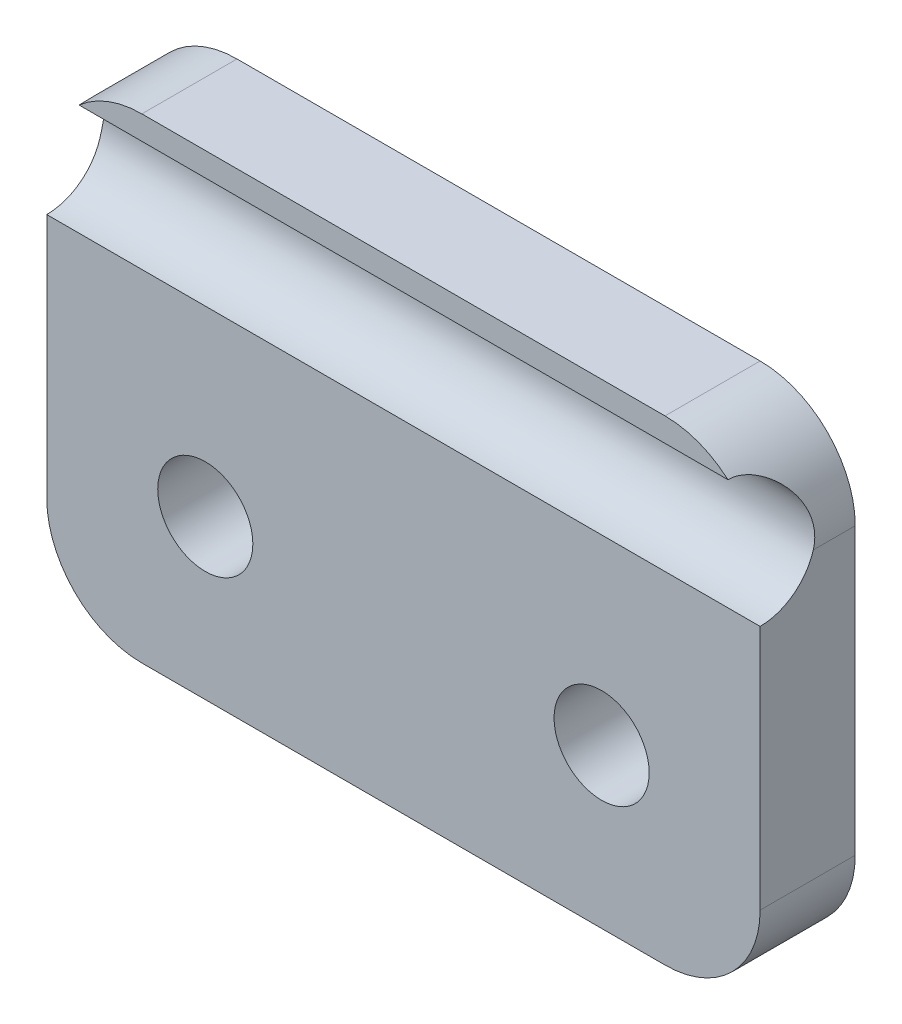
ISO-10303-21;
HEADER;
FILE_DESCRIPTION(('STEP AP214'),'2;1');
FILE_NAME('part.step','',(''),(''),'','','');
FILE_SCHEMA(('AUTOMOTIVE_DESIGN { 1 0 10303 214 1 1 1 1 }'));
ENDSEC;
DATA;
#1=APPLICATION_CONTEXT('core data for automotive mechanical design processes');
#2=APPLICATION_PROTOCOL_DEFINITION('international standard','automotive_design',2000,#1);
#3=PRODUCT_CONTEXT('',#1,'mechanical');
#4=PRODUCT('Part','Part','',(#3));
#5=PRODUCT_RELATED_PRODUCT_CATEGORY('part','',(#4));
#6=PRODUCT_DEFINITION_FORMATION('','',#4);
#7=PRODUCT_DEFINITION_CONTEXT('part definition',#1,'design');
#8=PRODUCT_DEFINITION('design','',#6,#7);
#9=PRODUCT_DEFINITION_SHAPE('','',#8);
#10=(LENGTH_UNIT() NAMED_UNIT(*) SI_UNIT(.MILLI.,.METRE.));
#11=(NAMED_UNIT(*) PLANE_ANGLE_UNIT() SI_UNIT($,.RADIAN.));
#12=(NAMED_UNIT(*) SI_UNIT($,.STERADIAN.) SOLID_ANGLE_UNIT());
#13=UNCERTAINTY_MEASURE_WITH_UNIT(LENGTH_MEASURE(1.E-05),#10,'distance_accuracy_value','');
#14=(GEOMETRIC_REPRESENTATION_CONTEXT(3) GLOBAL_UNCERTAINTY_ASSIGNED_CONTEXT((#13)) GLOBAL_UNIT_ASSIGNED_CONTEXT((#10,
#11,#12)) REPRESENTATION_CONTEXT('',''));
#15=CARTESIAN_POINT('',(0.,0.,0.));
#16=DIRECTION('',(0.,0.,1.));
#17=DIRECTION('',(1.,0.,0.));
#18=AXIS2_PLACEMENT_3D('',#15,#16,#17);
#19=CARTESIAN_POINT('',(16.5,9.,6.));
#20=DIRECTION('',(0.,0.,1.));
#21=DIRECTION('',(1.,0.,0.));
#22=AXIS2_PLACEMENT_3D('',#19,#20,#21);
#23=PLANE('',#22);
#24=CARTESIAN_POINT('',(-12.5,-5.,6.));
#25=DIRECTION('',(0.,0.,1.));
#26=DIRECTION('',(1.,0.,0.));
#27=AXIS2_PLACEMENT_3D('',#24,#25,#26);
#28=CIRCLE('',#27,3.);
#29=CARTESIAN_POINT('',(-9.5,-5.,6.));
#30=VERTEX_POINT('',#29);
#31=EDGE_CURVE('E245',#30,#30,#28,.T.);
#32=ORIENTED_EDGE('',*,*,#31,.F.);
#33=EDGE_LOOP('',(#32));
#34=FACE_BOUND('',#33,.T.);
#35=CARTESIAN_POINT('',(12.5,-5.,6.));
#36=DIRECTION('',(0.,0.,1.));
#37=DIRECTION('',(1.,0.,0.));
#38=AXIS2_PLACEMENT_3D('',#35,#36,#37);
#39=CIRCLE('',#38,3.);
#40=CARTESIAN_POINT('',(15.5,-5.,6.));
#41=VERTEX_POINT('',#40);
#42=EDGE_CURVE('E248',#41,#41,#39,.T.);
#43=ORIENTED_EDGE('',*,*,#42,.F.);
#44=EDGE_LOOP('',(#43));
#45=FACE_BOUND('',#44,.T.);
#46=DIRECTION('',(1.,0.,0.));
#47=VECTOR('',#46,1.);
#48=CARTESIAN_POINT('',(-22.5,6.5,6.));
#49=LINE('',#48,#47);
#50=CARTESIAN_POINT('',(-22.5,6.5,6.));
#51=VERTEX_POINT('',#50);
#52=CARTESIAN_POINT('',(22.5,6.5,6.));
#53=VERTEX_POINT('',#52);
#54=EDGE_CURVE('E11',#51,#53,#49,.T.);
#55=ORIENTED_EDGE('',*,*,#54,.F.);
#56=DIRECTION('',(0.,-1.,0.));
#57=VECTOR('',#56,1.);
#58=CARTESIAN_POINT('',(-22.5,-8.99999999999996,6.));
#59=LINE('',#58,#57);
#60=CARTESIAN_POINT('',(-22.5,-8.99999999999996,6.));
#61=VERTEX_POINT('',#60);
#62=EDGE_CURVE('E117',#51,#61,#59,.T.);
#63=ORIENTED_EDGE('',*,*,#62,.T.);
#64=CARTESIAN_POINT('',(-16.5,-9.,6.));
#65=DIRECTION('',(0.,0.,1.));
#66=DIRECTION('',(1.,0.,0.));
#67=AXIS2_PLACEMENT_3D('',#64,#65,#66);
#68=CIRCLE('',#67,6.);
#69=CARTESIAN_POINT('',(-16.5,-15.,6.));
#70=VERTEX_POINT('',#69);
#71=EDGE_CURVE('E110',#61,#70,#68,.T.);
#72=ORIENTED_EDGE('',*,*,#71,.T.);
#73=DIRECTION('',(1.,0.,0.));
#74=VECTOR('',#73,1.);
#75=CARTESIAN_POINT('',(-16.5,-15.,6.));
#76=LINE('',#75,#74);
#77=CARTESIAN_POINT('',(16.5,-15.,6.));
#78=VERTEX_POINT('',#77);
#79=EDGE_CURVE('E114',#70,#78,#76,.T.);
#80=ORIENTED_EDGE('',*,*,#79,.T.);
#81=CARTESIAN_POINT('',(16.5,-9.,6.));
#82=DIRECTION('',(0.,0.,1.));
#83=DIRECTION('',(1.,0.,0.));
#84=AXIS2_PLACEMENT_3D('',#81,#82,#83);
#85=CIRCLE('',#84,6.);
#86=CARTESIAN_POINT('',(22.5,-8.99999999999996,6.));
#87=VERTEX_POINT('',#86);
#88=EDGE_CURVE('E59',#78,#87,#85,.T.);
#89=ORIENTED_EDGE('',*,*,#88,.T.);
#90=DIRECTION('',(0.,1.,0.));
#91=VECTOR('',#90,1.);
#92=CARTESIAN_POINT('',(22.5,-8.99999999999996,6.));
#93=LINE('',#92,#91);
#94=EDGE_CURVE('E135',#87,#53,#93,.T.);
#95=ORIENTED_EDGE('',*,*,#94,.T.);
#96=EDGE_LOOP('',(#55,#63,#72,#80,#89,#95));
#97=FACE_BOUND('',#96,.T.);
#98=ADVANCED_FACE('F34',(#34,#45,#97),#23,.T.);
#99=CARTESIAN_POINT('',(16.5,9.,6.));
#100=DIRECTION('',(0.,0.,-1.));
#101=DIRECTION('',(-1.,0.,0.));
#102=AXIS2_PLACEMENT_3D('',#99,#100,#101);
#103=CYLINDRICAL_SURFACE('',#102,6.);
#104=CARTESIAN_POINT('',(16.5,9.,6.));
#105=DIRECTION('',(0.,0.,1.));
#106=DIRECTION('',(1.,0.,0.));
#107=AXIS2_PLACEMENT_3D('',#104,#105,#106);
#108=CIRCLE('',#107,6.);
#109=CARTESIAN_POINT('',(20.4686269665969,13.5,6.));
#110=VERTEX_POINT('',#109);
#111=CARTESIAN_POINT('',(16.5,15.,6.));
#112=VERTEX_POINT('',#111);
#113=EDGE_CURVE('E100',#110,#112,#108,.T.);
#114=ORIENTED_EDGE('',*,*,#113,.F.);
#115=CARTESIAN_POINT('',(20.4686269665969,13.5,6.));
#116=CARTESIAN_POINT('',(20.4685712039067,13.5000257506439,5.91881632101396));
#117=CARTESIAN_POINT('',(20.4718282121924,13.497176599036,5.83767095551206));
#118=CARTESIAN_POINT('',(20.4845324652196,13.4859367013396,5.67639814735833));
#119=CARTESIAN_POINT('',(20.4939683043637,13.4775561654911,5.59626910592828));
#120=CARTESIAN_POINT('',(20.5184342567479,13.4556070891319,5.43871897225722));
#121=CARTESIAN_POINT('',(20.5333883915866,13.4421089439923,5.36127604766474));
#122=CARTESIAN_POINT('',(20.568222947562,13.4102293771496,5.20852832331741));
#123=CARTESIAN_POINT('',(20.5881054123613,13.3918459293979,5.13322442504188));
#124=CARTESIAN_POINT('',(20.6536993783797,13.3301677907789,4.91223145460965));
#125=CARTESIAN_POINT('',(20.7055751510283,13.2801604766396,4.770197902551));
#126=CARTESIAN_POINT('',(20.8203045893178,13.1643273471022,4.49693224315633));
#127=CARTESIAN_POINT('',(20.8832051635746,13.098433468148,4.36574996574276));
#128=CARTESIAN_POINT('',(20.9989152295835,12.9705510341757,4.14588128858162));
#129=CARTESIAN_POINT('',(21.0503914061895,12.9116020192364,4.05468929913031));
#130=CARTESIAN_POINT('',(21.155327226413,12.7861083194756,3.87885070462966));
#131=CARTESIAN_POINT('',(21.2087876093891,12.7195607837055,3.794206576437));
#132=CARTESIAN_POINT('',(21.3163653592318,12.5791693065101,3.63157661275353));
#133=CARTESIAN_POINT('',(21.3704830321546,12.5053218420484,3.55359402638303));
#134=CARTESIAN_POINT('',(21.4782274837656,12.3505443452286,3.40452501771764));
#135=CARTESIAN_POINT('',(21.531854004249,12.2696107999752,3.33344205312303));
#136=CARTESIAN_POINT('',(21.6379514809875,12.1002445336585,3.19806957924992));
#137=CARTESIAN_POINT('',(21.6904102395758,12.0117584887584,3.13383707250817));
#138=CARTESIAN_POINT('',(21.7927185030769,11.8281055305886,3.01334785153727));
#139=CARTESIAN_POINT('',(21.842568351832,11.7329395016006,2.95709008459554));
#140=CARTESIAN_POINT('',(21.9385966083732,11.5364515642217,2.85331524752364));
#141=CARTESIAN_POINT('',(21.9847820212543,11.4351420880221,2.80578126034082));
#142=CARTESIAN_POINT('',(22.0726181935739,11.2268210678515,2.7201201814076));
#143=CARTESIAN_POINT('',(22.1142706568848,11.1198116890794,2.68198954819676));
#144=CARTESIAN_POINT('',(22.2114493051305,10.8464543107919,2.59960812548707));
#145=CARTESIAN_POINT('',(22.2636655051514,10.6769053078046,2.56163795693408));
#146=CARTESIAN_POINT('',(22.3309181947735,10.4172004513612,2.52384769386879));
#147=CARTESIAN_POINT('',(22.3514906249361,10.3297344623024,2.514445106097));
#148=CARTESIAN_POINT('',(22.3887551065579,10.153535597311,2.50225695766959));
#149=CARTESIAN_POINT('',(22.405449031831,10.0648033552267,2.49946819566852));
#150=CARTESIAN_POINT('',(22.4335750432093,9.89416687107595,2.50064816634559));
#151=CARTESIAN_POINT('',(22.4453300989334,9.81231115525161,2.50407209147982));
#152=CARTESIAN_POINT('',(22.4654072036045,9.64862584201443,2.51671512488739));
#153=CARTESIAN_POINT('',(22.4737294325341,9.5667962434571,2.52593392927178));
#154=CARTESIAN_POINT('',(22.4869840717032,9.40342666369023,2.5502261542065));
#155=CARTESIAN_POINT('',(22.4919039489604,9.32188884244028,2.56532090392144));
#156=CARTESIAN_POINT('',(22.4984184767825,9.15994945122304,2.60129157295705));
#157=CARTESIAN_POINT('',(22.5000125892987,9.07954806720019,2.62216842709891));
#158=CARTESIAN_POINT('',(22.5,8.99999999999996,2.64589803375033));
#159=B_SPLINE_CURVE_WITH_KNOTS('',3,(#115,#116,#117,#118,#119,#120,#121,#122,#123,#124,#125,
#126,#127,#128,#129,#130,#131,#132,#133,#134,#135,#136,#137,#138,#139,#140,#141,#142,#143,#144,
#145,#146,#147,#148,#149,#150,#151,#152,#153,#154,#155,#156,#157,#158),.UNSPECIFIED.,.F.,.F.,(4,
2,2,2,2,2,2,2,2,2,2,2,2,2,2,2,2,2,2,2,2,4),(0.,0.243374336470818,0.486300686197769,
0.726000045009978,0.965798968288863,1.44156335990039,1.91940349184481,2.27948375399213,
2.63969956418897,3.00009007573786,3.36066027211732,3.72402871595244,4.08734914825685,
4.4499574125265,4.81242890317947,5.35394673094795,5.62471051966392,5.895343221544,
6.14337806339321,6.39139989914564,6.64033055601176,6.88930148223554),.UNSPECIFIED.);
#160=CARTESIAN_POINT('',(22.5,8.99999999999996,2.64589803375033));
#161=VERTEX_POINT('',#160);
#162=EDGE_CURVE('E50',#110,#161,#159,.T.);
#163=ORIENTED_EDGE('',*,*,#162,.T.);
#164=DIRECTION('',(0.,0.,-1.));
#165=VECTOR('',#164,1.);
#166=CARTESIAN_POINT('',(22.5,8.99999999999996,6.));
#167=LINE('',#166,#165);
#168=CARTESIAN_POINT('',(22.5,8.99999999999996,0.));
#169=VERTEX_POINT('',#168);
#170=EDGE_CURVE('E92',#161,#169,#167,.T.);
#171=ORIENTED_EDGE('',*,*,#170,.T.);
#172=CARTESIAN_POINT('',(16.5,9.,0.));
#173=DIRECTION('',(0.,0.,1.));
#174=DIRECTION('',(1.,0.,0.));
#175=AXIS2_PLACEMENT_3D('',#172,#173,#174);
#176=CIRCLE('',#175,6.);
#177=CARTESIAN_POINT('',(16.5,15.,0.));
#178=VERTEX_POINT('',#177);
#179=EDGE_CURVE('E140',#169,#178,#176,.T.);
#180=ORIENTED_EDGE('',*,*,#179,.T.);
#181=DIRECTION('',(0.,0.,-1.));
#182=VECTOR('',#181,1.);
#183=CARTESIAN_POINT('',(16.5,15.,6.));
#184=LINE('',#183,#182);
#185=EDGE_CURVE('E167',#112,#178,#184,.T.);
#186=ORIENTED_EDGE('',*,*,#185,.F.);
#187=EDGE_LOOP('',(#114,#163,#171,#180,#186));
#188=FACE_BOUND('',#187,.T.);
#189=ADVANCED_FACE('F36',(#188),#103,.T.);
#190=CARTESIAN_POINT('',(-16.5,15.,6.));
#191=DIRECTION('',(0.,-1.,0.));
#192=DIRECTION('',(0.,0.,-1.));
#193=AXIS2_PLACEMENT_3D('',#190,#191,#192);
#194=PLANE('',#193);
#195=DIRECTION('',(-1.,0.,0.));
#196=VECTOR('',#195,1.);
#197=CARTESIAN_POINT('',(-16.5,15.,0.));
#198=LINE('',#197,#196);
#199=CARTESIAN_POINT('',(-16.5,15.,0.));
#200=VERTEX_POINT('',#199);
#201=EDGE_CURVE('E142',#178,#200,#198,.T.);
#202=ORIENTED_EDGE('',*,*,#201,.T.);
#203=DIRECTION('',(0.,0.,-1.));
#204=VECTOR('',#203,1.);
#205=CARTESIAN_POINT('',(-16.5,15.,6.));
#206=LINE('',#205,#204);
#207=CARTESIAN_POINT('',(-16.5,15.,6.));
#208=VERTEX_POINT('',#207);
#209=EDGE_CURVE('E164',#208,#200,#206,.T.);
#210=ORIENTED_EDGE('',*,*,#209,.F.);
#211=DIRECTION('',(-1.,0.,0.));
#212=VECTOR('',#211,1.);
#213=CARTESIAN_POINT('',(-16.5,15.,6.));
#214=LINE('',#213,#212);
#215=EDGE_CURVE('E185',#112,#208,#214,.T.);
#216=ORIENTED_EDGE('',*,*,#215,.F.);
#217=ORIENTED_EDGE('',*,*,#185,.T.);
#218=EDGE_LOOP('',(#202,#210,#216,#217));
#219=FACE_BOUND('',#218,.T.);
#220=ADVANCED_FACE('F232',(#219),#194,.F.);
#221=CARTESIAN_POINT('',(-16.5,9.,6.));
#222=DIRECTION('',(0.,0.,-1.));
#223=DIRECTION('',(-1.,0.,0.));
#224=AXIS2_PLACEMENT_3D('',#221,#222,#223);
#225=CYLINDRICAL_SURFACE('',#224,6.);
#226=DIRECTION('',(0.,0.,-1.));
#227=VECTOR('',#226,1.);
#228=CARTESIAN_POINT('',(-22.5,8.99999999999996,6.));
#229=LINE('',#228,#227);
#230=CARTESIAN_POINT('',(-22.5,8.99999999999996,2.64589803375033));
#231=VERTEX_POINT('',#230);
#232=CARTESIAN_POINT('',(-22.5,8.99999999999996,0.));
#233=VERTEX_POINT('',#232);
#234=EDGE_CURVE('E162',#231,#233,#229,.T.);
#235=ORIENTED_EDGE('',*,*,#234,.F.);
#236=CARTESIAN_POINT('',(-22.5,8.99999999999996,2.64589803375033));
#237=CARTESIAN_POINT('',(-22.5000153224947,9.08426082111713,2.62076075256933));
#238=CARTESIAN_POINT('',(-22.498225362984,9.16947786275634,2.59882691164411));
#239=CARTESIAN_POINT('',(-22.4909053674447,9.34115345622795,2.56145226513861));
#240=CARTESIAN_POINT('',(-22.4853758373783,9.42761183855889,2.54601058163103));
#241=CARTESIAN_POINT('',(-22.4704795034489,9.60074761001633,2.52175206272038));
#242=CARTESIAN_POINT('',(-22.461129377248,9.68742244014785,2.51290690042173));
#243=CARTESIAN_POINT('',(-22.438594170311,9.86066654012441,2.50169572864789));
#244=CARTESIAN_POINT('',(-22.4254091847197,9.9472358125349,2.49932955844096));
#245=CARTESIAN_POINT('',(-22.3801763990831,10.2058226957985,2.50181988099854));
#246=CARTESIAN_POINT('',(-22.3424376996476,10.3768722536701,2.51624433555202));
#247=CARTESIAN_POINT('',(-22.2533317979319,10.711514042865,2.56888651192755));
#248=CARTESIAN_POINT('',(-22.2019553179577,10.8751011083879,2.60712045511365));
#249=CARTESIAN_POINT('',(-22.0855957692794,11.1981332507593,2.70694310259581));
#250=CARTESIAN_POINT('',(-22.0201366065313,11.3571248797767,2.76943497316689));
#251=CARTESIAN_POINT('',(-21.8801655317774,11.6611829393199,2.91472636837726));
#252=CARTESIAN_POINT('',(-21.8056489467897,11.8062421120154,2.99753639836641));
#253=CARTESIAN_POINT('',(-21.6381394339971,12.1037451431088,3.19619591728656));
#254=CARTESIAN_POINT('',(-21.5441237331029,12.253477457283,3.31523967890172));
#255=CARTESIAN_POINT('',(-21.3538081482058,12.5311334025296,3.57521053328361));
#256=CARTESIAN_POINT('',(-21.2575059675333,12.659033948946,3.71616049230801));
#257=CARTESIAN_POINT('',(-21.0732487152937,12.8866309407066,4.01234511741854));
#258=CARTESIAN_POINT('',(-20.985112881475,12.9872908910079,4.16672436076348));
#259=CARTESIAN_POINT('',(-20.8205689981406,13.1650073615941,4.49422990238932));
#260=CARTESIAN_POINT('',(-20.7441417541962,13.242102723467,4.66732470706811));
#261=CARTESIAN_POINT('',(-20.6322604174454,13.3507143732209,4.97941132135309));
#262=CARTESIAN_POINT('',(-20.5913381835675,13.388959476829,5.11402835691869));
#263=CARTESIAN_POINT('',(-20.5419910640441,13.4342753373418,5.3212142975184));
#264=CARTESIAN_POINT('',(-20.5275570800474,13.4473644193252,5.39107558424723));
#265=CARTESIAN_POINT('',(-20.503166445183,13.469332259572,5.53221319106105));
#266=CARTESIAN_POINT('',(-20.4932073677945,13.4782132997915,5.6034887223231));
#267=CARTESIAN_POINT('',(-20.4800472464072,13.4899089280472,5.72898013555496));
#268=CARTESIAN_POINT('',(-20.4757783417054,13.4936857906826,5.78299787262598));
#269=CARTESIAN_POINT('',(-20.4700616935934,13.4987346908511,5.8913399958202));
#270=CARTESIAN_POINT('',(-20.4686161244438,13.5000047979308,5.94566458599143));
#271=CARTESIAN_POINT('',(-20.4686269665969,13.5,6.));
#272=B_SPLINE_CURVE_WITH_KNOTS('',3,(#236,#237,#238,#239,#240,#241,#242,#243,#244,#245,#246,
#247,#248,#249,#250,#251,#252,#253,#254,#255,#256,#257,#258,#259,#260,#261,#262,#263,#264,#265,
#266,#267,#268,#269,#270,#271),.UNSPECIFIED.,.F.,.F.,(4,2,2,2,2,2,2,2,2,2,2,2,2,2,2,2,2,4),(0.,
0.263709931809799,0.52738419093701,0.789919550680823,1.05244839735187,1.57704760178794,
2.10200460638074,2.64874191881364,3.19576251553278,3.83278139065019,4.47046972468057,
5.08120868233543,5.69093545967552,6.12656472637051,6.34391549760353,6.56114826758785,
6.72397553392443,6.88692814475174),.UNSPECIFIED.);
#273=CARTESIAN_POINT('',(-20.4686269665969,13.5,6.));
#274=VERTEX_POINT('',#273);
#275=EDGE_CURVE('E174',#231,#274,#272,.T.);
#276=ORIENTED_EDGE('',*,*,#275,.T.);
#277=CARTESIAN_POINT('',(-16.5,9.,6.));
#278=DIRECTION('',(0.,0.,1.));
#279=DIRECTION('',(-1.,0.,0.));
#280=AXIS2_PLACEMENT_3D('',#277,#278,#279);
#281=CIRCLE('',#280,6.);
#282=EDGE_CURVE('E181',#208,#274,#281,.T.);
#283=ORIENTED_EDGE('',*,*,#282,.F.);
#284=ORIENTED_EDGE('',*,*,#209,.T.);
#285=CARTESIAN_POINT('',(-16.5,9.,0.));
#286=DIRECTION('',(0.,0.,1.));
#287=DIRECTION('',(-1.,0.,0.));
#288=AXIS2_PLACEMENT_3D('',#285,#286,#287);
#289=CIRCLE('',#288,6.);
#290=EDGE_CURVE('E144',#200,#233,#289,.T.);
#291=ORIENTED_EDGE('',*,*,#290,.T.);
#292=EDGE_LOOP('',(#235,#276,#283,#284,#291));
#293=FACE_BOUND('',#292,.T.);
#294=ADVANCED_FACE('F180',(#293),#225,.T.);
#295=CARTESIAN_POINT('',(-22.5,-8.99999999999996,6.));
#296=DIRECTION('',(1.,0.,0.));
#297=DIRECTION('',(0.,0.,-1.));
#298=AXIS2_PLACEMENT_3D('',#295,#296,#297);
#299=PLANE('',#298);
#300=ORIENTED_EDGE('',*,*,#62,.F.);
#301=CARTESIAN_POINT('',(-22.5,10.,6.));
#302=DIRECTION('',(1.,0.,0.));
#303=DIRECTION('',(0.,0.,-1.));
#304=AXIS2_PLACEMENT_3D('',#301,#302,#303);
#305=CIRCLE('',#304,3.5);
#306=EDGE_CURVE('E182',#51,#231,#305,.T.);
#307=ORIENTED_EDGE('',*,*,#306,.T.);
#308=ORIENTED_EDGE('',*,*,#234,.T.);
#309=DIRECTION('',(0.,-1.,0.));
#310=VECTOR('',#309,1.);
#311=CARTESIAN_POINT('',(-22.5,-8.99999999999996,0.));
#312=LINE('',#311,#310);
#313=CARTESIAN_POINT('',(-22.5,-8.99999999999996,0.));
#314=VERTEX_POINT('',#313);
#315=EDGE_CURVE('E147',#233,#314,#312,.T.);
#316=ORIENTED_EDGE('',*,*,#315,.T.);
#317=DIRECTION('',(0.,0.,-1.));
#318=VECTOR('',#317,1.);
#319=CARTESIAN_POINT('',(-22.5,-8.99999999999996,6.));
#320=LINE('',#319,#318);
#321=EDGE_CURVE('E129',#61,#314,#320,.T.);
#322=ORIENTED_EDGE('',*,*,#321,.F.);
#323=EDGE_LOOP('',(#300,#307,#308,#316,#322));
#324=FACE_BOUND('',#323,.T.);
#325=ADVANCED_FACE('F227',(#324),#299,.F.);
#326=CARTESIAN_POINT('',(-16.5,-9.,6.));
#327=DIRECTION('',(0.,0.,-1.));
#328=DIRECTION('',(-1.,0.,0.));
#329=AXIS2_PLACEMENT_3D('',#326,#327,#328);
#330=CYLINDRICAL_SURFACE('',#329,6.);
#331=CARTESIAN_POINT('',(-16.5,-9.,0.));
#332=DIRECTION('',(0.,0.,1.));
#333=DIRECTION('',(1.,0.,0.));
#334=AXIS2_PLACEMENT_3D('',#331,#332,#333);
#335=CIRCLE('',#334,6.);
#336=CARTESIAN_POINT('',(-16.5,-15.,0.));
#337=VERTEX_POINT('',#336);
#338=EDGE_CURVE('E126',#314,#337,#335,.T.);
#339=ORIENTED_EDGE('',*,*,#338,.T.);
#340=DIRECTION('',(0.,0.,-1.));
#341=VECTOR('',#340,1.);
#342=CARTESIAN_POINT('',(-16.5,-15.,6.));
#343=LINE('',#342,#341);
#344=EDGE_CURVE('E123',#70,#337,#343,.T.);
#345=ORIENTED_EDGE('',*,*,#344,.F.);
#346=ORIENTED_EDGE('',*,*,#71,.F.);
#347=ORIENTED_EDGE('',*,*,#321,.T.);
#348=EDGE_LOOP('',(#339,#345,#346,#347));
#349=FACE_BOUND('',#348,.T.);
#350=ADVANCED_FACE('F124',(#349),#330,.T.);
#351=CARTESIAN_POINT('',(-16.5,-15.,6.));
#352=DIRECTION('',(0.,1.,0.));
#353=DIRECTION('',(0.,0.,1.));
#354=AXIS2_PLACEMENT_3D('',#351,#352,#353);
#355=PLANE('',#354);
#356=DIRECTION('',(1.,0.,0.));
#357=VECTOR('',#356,1.);
#358=CARTESIAN_POINT('',(-16.5,-15.,0.));
#359=LINE('',#358,#357);
#360=CARTESIAN_POINT('',(16.5,-15.,0.));
#361=VERTEX_POINT('',#360);
#362=EDGE_CURVE('E150',#337,#361,#359,.T.);
#363=ORIENTED_EDGE('',*,*,#362,.T.);
#364=DIRECTION('',(0.,0.,-1.));
#365=VECTOR('',#364,1.);
#366=CARTESIAN_POINT('',(16.5,-15.,6.));
#367=LINE('',#366,#365);
#368=EDGE_CURVE('E130',#78,#361,#367,.T.);
#369=ORIENTED_EDGE('',*,*,#368,.F.);
#370=ORIENTED_EDGE('',*,*,#79,.F.);
#371=ORIENTED_EDGE('',*,*,#344,.T.);
#372=EDGE_LOOP('',(#363,#369,#370,#371));
#373=FACE_BOUND('',#372,.T.);
#374=ADVANCED_FACE('F132',(#373),#355,.F.);
#375=CARTESIAN_POINT('',(16.5,-9.,6.));
#376=DIRECTION('',(0.,0.,-1.));
#377=DIRECTION('',(-1.,0.,0.));
#378=AXIS2_PLACEMENT_3D('',#375,#376,#377);
#379=CYLINDRICAL_SURFACE('',#378,6.);
#380=CARTESIAN_POINT('',(16.5,-9.,0.));
#381=DIRECTION('',(0.,0.,1.));
#382=DIRECTION('',(1.,0.,0.));
#383=AXIS2_PLACEMENT_3D('',#380,#381,#382);
#384=CIRCLE('',#383,6.);
#385=CARTESIAN_POINT('',(22.5,-8.99999999999996,0.));
#386=VERTEX_POINT('',#385);
#387=EDGE_CURVE('E152',#361,#386,#384,.T.);
#388=ORIENTED_EDGE('',*,*,#387,.T.);
#389=DIRECTION('',(0.,0.,-1.));
#390=VECTOR('',#389,1.);
#391=CARTESIAN_POINT('',(22.5,-8.99999999999996,6.));
#392=LINE('',#391,#390);
#393=EDGE_CURVE('E157',#87,#386,#392,.T.);
#394=ORIENTED_EDGE('',*,*,#393,.F.);
#395=ORIENTED_EDGE('',*,*,#88,.F.);
#396=ORIENTED_EDGE('',*,*,#368,.T.);
#397=EDGE_LOOP('',(#388,#394,#395,#396));
#398=FACE_BOUND('',#397,.T.);
#399=ADVANCED_FACE('F218',(#398),#379,.T.);
#400=CARTESIAN_POINT('',(22.5,-8.99999999999996,6.));
#401=DIRECTION('',(-1.,0.,0.));
#402=DIRECTION('',(0.,0.,1.));
#403=AXIS2_PLACEMENT_3D('',#400,#401,#402);
#404=PLANE('',#403);
#405=ORIENTED_EDGE('',*,*,#170,.F.);
#406=CARTESIAN_POINT('',(22.5,10.,6.));
#407=DIRECTION('',(1.,0.,0.));
#408=DIRECTION('',(0.,0.,-1.));
#409=AXIS2_PLACEMENT_3D('',#406,#407,#408);
#410=CIRCLE('',#409,3.5);
#411=EDGE_CURVE('E252',#53,#161,#410,.T.);
#412=ORIENTED_EDGE('',*,*,#411,.F.);
#413=ORIENTED_EDGE('',*,*,#94,.F.);
#414=ORIENTED_EDGE('',*,*,#393,.T.);
#415=DIRECTION('',(0.,1.,0.));
#416=VECTOR('',#415,1.);
#417=CARTESIAN_POINT('',(22.5,-8.99999999999996,0.));
#418=LINE('',#417,#416);
#419=EDGE_CURVE('E154',#386,#169,#418,.T.);
#420=ORIENTED_EDGE('',*,*,#419,.T.);
#421=EDGE_LOOP('',(#405,#412,#413,#414,#420));
#422=FACE_BOUND('',#421,.T.);
#423=ADVANCED_FACE('F212',(#422),#404,.F.);
#424=DIRECTION('',(1.,0.,0.));
#425=VECTOR('',#424,1.);
#426=CARTESIAN_POINT('',(-22.5,13.5,6.));
#427=LINE('',#426,#425);
#428=EDGE_CURVE('E43',#110,#274,#427,.F.);
#429=ORIENTED_EDGE('',*,*,#428,.F.);
#430=ORIENTED_EDGE('',*,*,#113,.T.);
#431=ORIENTED_EDGE('',*,*,#215,.T.);
#432=ORIENTED_EDGE('',*,*,#282,.T.);
#433=EDGE_LOOP('',(#429,#430,#431,#432));
#434=FACE_BOUND('',#433,.T.);
#435=ADVANCED_FACE('F184',(#434),#23,.T.);
#436=CARTESIAN_POINT('',(16.5,9.,0.));
#437=DIRECTION('',(0.,0.,1.));
#438=DIRECTION('',(1.,0.,0.));
#439=AXIS2_PLACEMENT_3D('',#436,#437,#438);
#440=PLANE('',#439);
#441=CARTESIAN_POINT('',(-12.5,-5.,0.));
#442=DIRECTION('',(0.,0.,-1.));
#443=DIRECTION('',(-1.,0.,0.));
#444=AXIS2_PLACEMENT_3D('',#441,#442,#443);
#445=CIRCLE('',#444,3.);
#446=CARTESIAN_POINT('',(-15.5,-5.,0.));
#447=VERTEX_POINT('',#446);
#448=EDGE_CURVE('E250',#447,#447,#445,.T.);
#449=ORIENTED_EDGE('',*,*,#448,.F.);
#450=EDGE_LOOP('',(#449));
#451=FACE_BOUND('',#450,.T.);
#452=CARTESIAN_POINT('',(12.5,-5.,0.));
#453=DIRECTION('',(0.,0.,-1.));
#454=DIRECTION('',(-1.,0.,0.));
#455=AXIS2_PLACEMENT_3D('',#452,#453,#454);
#456=CIRCLE('',#455,3.);
#457=CARTESIAN_POINT('',(9.5,-5.,0.));
#458=VERTEX_POINT('',#457);
#459=EDGE_CURVE('E255',#458,#458,#456,.T.);
#460=ORIENTED_EDGE('',*,*,#459,.F.);
#461=EDGE_LOOP('',(#460));
#462=FACE_BOUND('',#461,.T.);
#463=ORIENTED_EDGE('',*,*,#179,.F.);
#464=ORIENTED_EDGE('',*,*,#419,.F.);
#465=ORIENTED_EDGE('',*,*,#387,.F.);
#466=ORIENTED_EDGE('',*,*,#362,.F.);
#467=ORIENTED_EDGE('',*,*,#338,.F.);
#468=ORIENTED_EDGE('',*,*,#315,.F.);
#469=ORIENTED_EDGE('',*,*,#290,.F.);
#470=ORIENTED_EDGE('',*,*,#201,.F.);
#471=EDGE_LOOP('',(#463,#464,#465,#466,#467,#468,#469,#470));
#472=FACE_BOUND('',#471,.T.);
#473=ADVANCED_FACE('F207',(#451,#462,#472),#440,.F.);
#474=CARTESIAN_POINT('',(-22.5,10.,6.));
#475=DIRECTION('',(1.,0.,0.));
#476=DIRECTION('',(0.,0.,-1.));
#477=AXIS2_PLACEMENT_3D('',#474,#475,#476);
#478=CYLINDRICAL_SURFACE('',#477,3.5);
#479=ORIENTED_EDGE('',*,*,#54,.T.);
#480=ORIENTED_EDGE('',*,*,#411,.T.);
#481=ORIENTED_EDGE('',*,*,#162,.F.);
#482=ORIENTED_EDGE('',*,*,#428,.T.);
#483=ORIENTED_EDGE('',*,*,#275,.F.);
#484=ORIENTED_EDGE('',*,*,#306,.F.);
#485=EDGE_LOOP('',(#479,#480,#481,#482,#483,#484));
#486=FACE_BOUND('',#485,.T.);
#487=ADVANCED_FACE('F171',(#486),#478,.F.);
#488=CARTESIAN_POINT('',(12.5,-5.,44.));
#489=DIRECTION('',(0.,0.,-1.));
#490=DIRECTION('',(-1.,0.,0.));
#491=AXIS2_PLACEMENT_3D('',#488,#489,#490);
#492=CYLINDRICAL_SURFACE('',#491,3.);
#493=ORIENTED_EDGE('',*,*,#42,.T.);
#494=EDGE_LOOP('',(#493));
#495=FACE_BOUND('',#494,.T.);
#496=ORIENTED_EDGE('',*,*,#459,.T.);
#497=EDGE_LOOP('',(#496));
#498=FACE_BOUND('',#497,.T.);
#499=ADVANCED_FACE('F206',(#495,#498),#492,.F.);
#500=CARTESIAN_POINT('',(-12.5,-5.,44.));
#501=DIRECTION('',(0.,0.,-1.));
#502=DIRECTION('',(-1.,0.,0.));
#503=AXIS2_PLACEMENT_3D('',#500,#501,#502);
#504=CYLINDRICAL_SURFACE('',#503,3.);
#505=ORIENTED_EDGE('',*,*,#31,.T.);
#506=EDGE_LOOP('',(#505));
#507=FACE_BOUND('',#506,.T.);
#508=ORIENTED_EDGE('',*,*,#448,.T.);
#509=EDGE_LOOP('',(#508));
#510=FACE_BOUND('',#509,.T.);
#511=ADVANCED_FACE('F279',(#507,#510),#504,.F.);
#512=CLOSED_SHELL('',(#98,#189,#220,#294,#325,#350,#374,#399,#423,#435,#473,#487,#499,#511));
#513=MANIFOLD_SOLID_BREP('B2',#512);
#514=ADVANCED_BREP_SHAPE_REPRESENTATION('',(#18,#513),#14);
#515=SHAPE_DEFINITION_REPRESENTATION(#9,#514);
ENDSEC;
END-ISO-10303-21;
